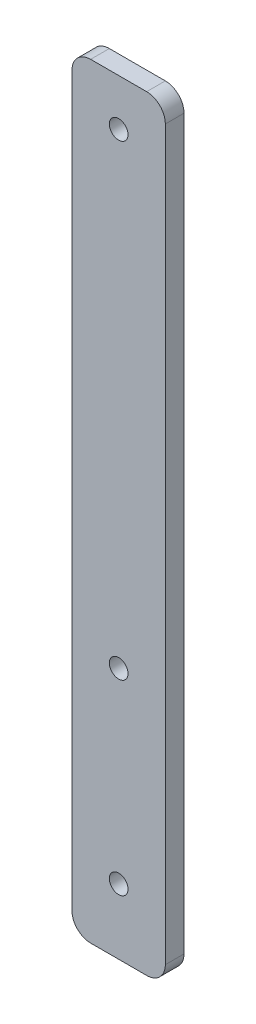
ISO-10303-21;
HEADER;
FILE_DESCRIPTION(('STEP AP214'),'2;1');
FILE_NAME('part.step','',(''),(''),'','','');
FILE_SCHEMA(('AUTOMOTIVE_DESIGN { 1 0 10303 214 1 1 1 1 }'));
ENDSEC;
DATA;
#1=APPLICATION_CONTEXT('core data for automotive mechanical design processes');
#2=APPLICATION_PROTOCOL_DEFINITION('international standard','automotive_design',2000,#1);
#3=PRODUCT_CONTEXT('',#1,'mechanical');
#4=PRODUCT('Part','Part','',(#3));
#5=PRODUCT_RELATED_PRODUCT_CATEGORY('part','',(#4));
#6=PRODUCT_DEFINITION_FORMATION('','',#4);
#7=PRODUCT_DEFINITION_CONTEXT('part definition',#1,'design');
#8=PRODUCT_DEFINITION('design','',#6,#7);
#9=PRODUCT_DEFINITION_SHAPE('','',#8);
#10=(LENGTH_UNIT() NAMED_UNIT(*) SI_UNIT(.MILLI.,.METRE.));
#11=(NAMED_UNIT(*) PLANE_ANGLE_UNIT() SI_UNIT($,.RADIAN.));
#12=(NAMED_UNIT(*) SI_UNIT($,.STERADIAN.) SOLID_ANGLE_UNIT());
#13=UNCERTAINTY_MEASURE_WITH_UNIT(LENGTH_MEASURE(1.E-05),#10,'distance_accuracy_value','');
#14=(GEOMETRIC_REPRESENTATION_CONTEXT(3) GLOBAL_UNCERTAINTY_ASSIGNED_CONTEXT((#13)) GLOBAL_UNIT_ASSIGNED_CONTEXT((#10,
#11,#12)) REPRESENTATION_CONTEXT('',''));
#15=CARTESIAN_POINT('',(0.,0.,0.));
#16=DIRECTION('',(0.,0.,1.));
#17=DIRECTION('',(1.,0.,0.));
#18=AXIS2_PLACEMENT_3D('',#15,#16,#17);
#19=CARTESIAN_POINT('',(0.,0.,10.));
#20=DIRECTION('',(0.,0.,1.));
#21=DIRECTION('',(1.,0.,0.));
#22=AXIS2_PLACEMENT_3D('',#19,#20,#21);
#23=PLANE('',#22);
#24=CARTESIAN_POINT('',(25.,-375.,10.));
#25=DIRECTION('',(0.,0.,1.));
#26=DIRECTION('',(1.,0.,0.));
#27=AXIS2_PLACEMENT_3D('',#24,#25,#26);
#28=CIRCLE('',#27,5.);
#29=CARTESIAN_POINT('',(30.,-375.,10.));
#30=VERTEX_POINT('',#29);
#31=EDGE_CURVE('E194',#30,#30,#28,.T.);
#32=ORIENTED_EDGE('',*,*,#31,.F.);
#33=EDGE_LOOP('',(#32));
#34=FACE_BOUND('',#33,.T.);
#35=CARTESIAN_POINT('',(25.,-275.,10.));
#36=DIRECTION('',(0.,0.,1.));
#37=DIRECTION('',(1.,0.,0.));
#38=AXIS2_PLACEMENT_3D('',#35,#36,#37);
#39=CIRCLE('',#38,5.);
#40=CARTESIAN_POINT('',(30.,-275.,10.));
#41=VERTEX_POINT('',#40);
#42=EDGE_CURVE('E129',#41,#41,#39,.T.);
#43=ORIENTED_EDGE('',*,*,#42,.F.);
#44=EDGE_LOOP('',(#43));
#45=FACE_BOUND('',#44,.T.);
#46=DIRECTION('',(-1.,0.,0.));
#47=VECTOR('',#46,1.);
#48=CARTESIAN_POINT('',(0.,0.,10.));
#49=LINE('',#48,#47);
#50=CARTESIAN_POINT('',(40.,0.,10.));
#51=VERTEX_POINT('',#50);
#52=CARTESIAN_POINT('',(10.,0.,10.));
#53=VERTEX_POINT('',#52);
#54=EDGE_CURVE('E138',#51,#53,#49,.T.);
#55=ORIENTED_EDGE('',*,*,#54,.T.);
#56=CARTESIAN_POINT('',(10.,-10.,10.));
#57=DIRECTION('',(0.,0.,1.));
#58=DIRECTION('',(1.,0.,0.));
#59=AXIS2_PLACEMENT_3D('',#56,#57,#58);
#60=CIRCLE('',#59,10.);
#61=CARTESIAN_POINT('',(0.,-10.,10.));
#62=VERTEX_POINT('',#61);
#63=EDGE_CURVE('E156',#53,#62,#60,.T.);
#64=ORIENTED_EDGE('',*,*,#63,.T.);
#65=DIRECTION('',(0.,-1.,0.));
#66=VECTOR('',#65,1.);
#67=CARTESIAN_POINT('',(0.,0.,10.));
#68=LINE('',#67,#66);
#69=CARTESIAN_POINT('',(0.,-400.,10.));
#70=VERTEX_POINT('',#69);
#71=EDGE_CURVE('E120',#62,#70,#68,.T.);
#72=ORIENTED_EDGE('',*,*,#71,.T.);
#73=CARTESIAN_POINT('',(10.,-400.,10.));
#74=DIRECTION('',(0.,0.,1.));
#75=DIRECTION('',(1.,0.,0.));
#76=AXIS2_PLACEMENT_3D('',#73,#74,#75);
#77=CIRCLE('',#76,10.);
#78=CARTESIAN_POINT('',(10.,-410.,10.));
#79=VERTEX_POINT('',#78);
#80=EDGE_CURVE('E152',#70,#79,#77,.T.);
#81=ORIENTED_EDGE('',*,*,#80,.T.);
#82=DIRECTION('',(1.,0.,0.));
#83=VECTOR('',#82,1.);
#84=CARTESIAN_POINT('',(0.,-410.,10.));
#85=LINE('',#84,#83);
#86=CARTESIAN_POINT('',(40.,-410.,10.));
#87=VERTEX_POINT('',#86);
#88=EDGE_CURVE('E165',#79,#87,#85,.T.);
#89=ORIENTED_EDGE('',*,*,#88,.T.);
#90=CARTESIAN_POINT('',(40.,-400.,10.));
#91=DIRECTION('',(0.,0.,1.));
#92=DIRECTION('',(1.,0.,0.));
#93=AXIS2_PLACEMENT_3D('',#90,#91,#92);
#94=CIRCLE('',#93,10.);
#95=CARTESIAN_POINT('',(50.,-400.,10.));
#96=VERTEX_POINT('',#95);
#97=EDGE_CURVE('E55',#87,#96,#94,.T.);
#98=ORIENTED_EDGE('',*,*,#97,.T.);
#99=DIRECTION('',(0.,1.,0.));
#100=VECTOR('',#99,1.);
#101=CARTESIAN_POINT('',(50.,0.,10.));
#102=LINE('',#101,#100);
#103=CARTESIAN_POINT('',(50.,-9.99999999999999,10.));
#104=VERTEX_POINT('',#103);
#105=EDGE_CURVE('E171',#96,#104,#102,.T.);
#106=ORIENTED_EDGE('',*,*,#105,.T.);
#107=CARTESIAN_POINT('',(40.,-10.,10.));
#108=DIRECTION('',(0.,0.,1.));
#109=DIRECTION('',(1.,0.,0.));
#110=AXIS2_PLACEMENT_3D('',#107,#108,#109);
#111=CIRCLE('',#110,10.);
#112=EDGE_CURVE('E154',#104,#51,#111,.T.);
#113=ORIENTED_EDGE('',*,*,#112,.T.);
#114=EDGE_LOOP('',(#55,#64,#72,#81,#89,#98,#106,#113));
#115=FACE_BOUND('',#114,.T.);
#116=CARTESIAN_POINT('',(25.,-25.,10.));
#117=DIRECTION('',(0.,0.,1.));
#118=DIRECTION('',(1.,0.,0.));
#119=AXIS2_PLACEMENT_3D('',#116,#117,#118);
#120=CIRCLE('',#119,5.);
#121=CARTESIAN_POINT('',(30.,-25.,10.));
#122=VERTEX_POINT('',#121);
#123=EDGE_CURVE('E186',#122,#122,#120,.T.);
#124=ORIENTED_EDGE('',*,*,#123,.F.);
#125=EDGE_LOOP('',(#124));
#126=FACE_BOUND('',#125,.T.);
#127=ADVANCED_FACE('F33',(#34,#45,#115,#126),#23,.T.);
#128=CARTESIAN_POINT('',(0.,0.,0.));
#129=DIRECTION('',(0.,0.,1.));
#130=DIRECTION('',(1.,0.,0.));
#131=AXIS2_PLACEMENT_3D('',#128,#129,#130);
#132=PLANE('',#131);
#133=CARTESIAN_POINT('',(25.,-375.,0.));
#134=DIRECTION('',(0.,0.,1.));
#135=DIRECTION('',(1.,0.,0.));
#136=AXIS2_PLACEMENT_3D('',#133,#134,#135);
#137=CIRCLE('',#136,5.);
#138=CARTESIAN_POINT('',(30.,-375.,0.));
#139=VERTEX_POINT('',#138);
#140=EDGE_CURVE('E191',#139,#139,#137,.T.);
#141=ORIENTED_EDGE('',*,*,#140,.T.);
#142=EDGE_LOOP('',(#141));
#143=FACE_BOUND('',#142,.T.);
#144=DIRECTION('',(0.,-1.,0.));
#145=VECTOR('',#144,1.);
#146=CARTESIAN_POINT('',(0.,0.,0.));
#147=LINE('',#146,#145);
#148=CARTESIAN_POINT('',(0.,-10.,0.));
#149=VERTEX_POINT('',#148);
#150=CARTESIAN_POINT('',(0.,-400.,0.));
#151=VERTEX_POINT('',#150);
#152=EDGE_CURVE('E117',#149,#151,#147,.T.);
#153=ORIENTED_EDGE('',*,*,#152,.F.);
#154=CARTESIAN_POINT('',(10.,-10.,0.));
#155=DIRECTION('',(0.,0.,1.));
#156=DIRECTION('',(1.,0.,0.));
#157=AXIS2_PLACEMENT_3D('',#154,#155,#156);
#158=CIRCLE('',#157,10.);
#159=CARTESIAN_POINT('',(10.,0.,0.));
#160=VERTEX_POINT('',#159);
#161=EDGE_CURVE('E100',#149,#160,#158,.F.);
#162=ORIENTED_EDGE('',*,*,#161,.T.);
#163=DIRECTION('',(-1.,0.,0.));
#164=VECTOR('',#163,1.);
#165=CARTESIAN_POINT('',(0.,0.,0.));
#166=LINE('',#165,#164);
#167=CARTESIAN_POINT('',(40.,0.,0.));
#168=VERTEX_POINT('',#167);
#169=EDGE_CURVE('E142',#168,#160,#166,.T.);
#170=ORIENTED_EDGE('',*,*,#169,.F.);
#171=CARTESIAN_POINT('',(40.,-10.,0.));
#172=DIRECTION('',(0.,0.,1.));
#173=DIRECTION('',(1.,0.,0.));
#174=AXIS2_PLACEMENT_3D('',#171,#172,#173);
#175=CIRCLE('',#174,10.);
#176=CARTESIAN_POINT('',(50.,-9.99999999999999,0.));
#177=VERTEX_POINT('',#176);
#178=EDGE_CURVE('E111',#168,#177,#175,.F.);
#179=ORIENTED_EDGE('',*,*,#178,.T.);
#180=DIRECTION('',(0.,1.,0.));
#181=VECTOR('',#180,1.);
#182=CARTESIAN_POINT('',(50.,0.,0.));
#183=LINE('',#182,#181);
#184=CARTESIAN_POINT('',(50.,-400.,0.));
#185=VERTEX_POINT('',#184);
#186=EDGE_CURVE('E132',#185,#177,#183,.T.);
#187=ORIENTED_EDGE('',*,*,#186,.F.);
#188=CARTESIAN_POINT('',(40.,-400.,0.));
#189=DIRECTION('',(0.,0.,1.));
#190=DIRECTION('',(1.,0.,0.));
#191=AXIS2_PLACEMENT_3D('',#188,#189,#190);
#192=CIRCLE('',#191,10.);
#193=CARTESIAN_POINT('',(40.,-410.,0.));
#194=VERTEX_POINT('',#193);
#195=EDGE_CURVE('E121',#185,#194,#192,.F.);
#196=ORIENTED_EDGE('',*,*,#195,.T.);
#197=DIRECTION('',(1.,0.,0.));
#198=VECTOR('',#197,1.);
#199=CARTESIAN_POINT('',(0.,-410.,0.));
#200=LINE('',#199,#198);
#201=CARTESIAN_POINT('',(10.,-410.,0.));
#202=VERTEX_POINT('',#201);
#203=EDGE_CURVE('E128',#202,#194,#200,.T.);
#204=ORIENTED_EDGE('',*,*,#203,.F.);
#205=CARTESIAN_POINT('',(10.,-400.,0.));
#206=DIRECTION('',(0.,0.,1.));
#207=DIRECTION('',(1.,0.,0.));
#208=AXIS2_PLACEMENT_3D('',#205,#206,#207);
#209=CIRCLE('',#208,10.);
#210=EDGE_CURVE('E127',#202,#151,#209,.F.);
#211=ORIENTED_EDGE('',*,*,#210,.T.);
#212=EDGE_LOOP('',(#153,#162,#170,#179,#187,#196,#204,#211));
#213=FACE_BOUND('',#212,.T.);
#214=CARTESIAN_POINT('',(25.,-275.,0.));
#215=DIRECTION('',(0.,0.,1.));
#216=DIRECTION('',(1.,0.,0.));
#217=AXIS2_PLACEMENT_3D('',#214,#215,#216);
#218=CIRCLE('',#217,5.);
#219=CARTESIAN_POINT('',(30.,-275.,0.));
#220=VERTEX_POINT('',#219);
#221=EDGE_CURVE('E135',#220,#220,#218,.T.);
#222=ORIENTED_EDGE('',*,*,#221,.T.);
#223=EDGE_LOOP('',(#222));
#224=FACE_BOUND('',#223,.T.);
#225=CARTESIAN_POINT('',(25.,-25.,0.));
#226=DIRECTION('',(0.,0.,1.));
#227=DIRECTION('',(1.,0.,0.));
#228=AXIS2_PLACEMENT_3D('',#225,#226,#227);
#229=CIRCLE('',#228,5.);
#230=CARTESIAN_POINT('',(30.,-25.,0.));
#231=VERTEX_POINT('',#230);
#232=EDGE_CURVE('E188',#231,#231,#229,.T.);
#233=ORIENTED_EDGE('',*,*,#232,.T.);
#234=EDGE_LOOP('',(#233));
#235=FACE_BOUND('',#234,.T.);
#236=ADVANCED_FACE('F124',(#143,#213,#224,#235),#132,.F.);
#237=CARTESIAN_POINT('',(0.,0.,10.));
#238=DIRECTION('',(1.,0.,0.));
#239=DIRECTION('',(0.,1.,0.));
#240=AXIS2_PLACEMENT_3D('',#237,#238,#239);
#241=PLANE('',#240);
#242=ORIENTED_EDGE('',*,*,#71,.F.);
#243=DIRECTION('',(0.,0.,-1.));
#244=VECTOR('',#243,1.);
#245=CARTESIAN_POINT('',(0.,-10.,10.));
#246=LINE('',#245,#244);
#247=EDGE_CURVE('E104',#62,#149,#246,.T.);
#248=ORIENTED_EDGE('',*,*,#247,.T.);
#249=ORIENTED_EDGE('',*,*,#152,.T.);
#250=DIRECTION('',(0.,0.,-1.));
#251=VECTOR('',#250,1.);
#252=CARTESIAN_POINT('',(0.,-400.,10.));
#253=LINE('',#252,#251);
#254=EDGE_CURVE('E122',#151,#70,#253,.F.);
#255=ORIENTED_EDGE('',*,*,#254,.T.);
#256=EDGE_LOOP('',(#242,#248,#249,#255));
#257=FACE_BOUND('',#256,.T.);
#258=ADVANCED_FACE('F116',(#257),#241,.F.);
#259=CARTESIAN_POINT('',(0.,-410.,10.));
#260=DIRECTION('',(0.,1.,0.));
#261=DIRECTION('',(0.,0.,1.));
#262=AXIS2_PLACEMENT_3D('',#259,#260,#261);
#263=PLANE('',#262);
#264=ORIENTED_EDGE('',*,*,#88,.F.);
#265=DIRECTION('',(0.,0.,-1.));
#266=VECTOR('',#265,1.);
#267=CARTESIAN_POINT('',(10.,-410.,10.));
#268=LINE('',#267,#266);
#269=EDGE_CURVE('E11',#79,#202,#268,.T.);
#270=ORIENTED_EDGE('',*,*,#269,.T.);
#271=ORIENTED_EDGE('',*,*,#203,.T.);
#272=DIRECTION('',(0.,0.,-1.));
#273=VECTOR('',#272,1.);
#274=CARTESIAN_POINT('',(40.,-410.,10.));
#275=LINE('',#274,#273);
#276=EDGE_CURVE('E41',#194,#87,#275,.F.);
#277=ORIENTED_EDGE('',*,*,#276,.T.);
#278=EDGE_LOOP('',(#264,#270,#271,#277));
#279=FACE_BOUND('',#278,.T.);
#280=ADVANCED_FACE('F164',(#279),#263,.F.);
#281=CARTESIAN_POINT('',(50.,0.,10.));
#282=DIRECTION('',(-1.,0.,0.));
#283=DIRECTION('',(0.,-1.,0.));
#284=AXIS2_PLACEMENT_3D('',#281,#282,#283);
#285=PLANE('',#284);
#286=ORIENTED_EDGE('',*,*,#186,.T.);
#287=DIRECTION('',(0.,0.,-1.));
#288=VECTOR('',#287,1.);
#289=CARTESIAN_POINT('',(50.,-10.,10.));
#290=LINE('',#289,#288);
#291=EDGE_CURVE('E48',#177,#104,#290,.F.);
#292=ORIENTED_EDGE('',*,*,#291,.T.);
#293=ORIENTED_EDGE('',*,*,#105,.F.);
#294=DIRECTION('',(0.,0.,-1.));
#295=VECTOR('',#294,1.);
#296=CARTESIAN_POINT('',(50.,-400.,10.));
#297=LINE('',#296,#295);
#298=EDGE_CURVE('E158',#96,#185,#297,.T.);
#299=ORIENTED_EDGE('',*,*,#298,.T.);
#300=EDGE_LOOP('',(#286,#292,#293,#299));
#301=FACE_BOUND('',#300,.T.);
#302=ADVANCED_FACE('F175',(#301),#285,.F.);
#303=CARTESIAN_POINT('',(0.,0.,10.));
#304=DIRECTION('',(0.,-1.,0.));
#305=DIRECTION('',(0.,0.,-1.));
#306=AXIS2_PLACEMENT_3D('',#303,#304,#305);
#307=PLANE('',#306);
#308=ORIENTED_EDGE('',*,*,#169,.T.);
#309=DIRECTION('',(0.,0.,-1.));
#310=VECTOR('',#309,1.);
#311=CARTESIAN_POINT('',(10.,0.,10.));
#312=LINE('',#311,#310);
#313=EDGE_CURVE('E105',#160,#53,#312,.F.);
#314=ORIENTED_EDGE('',*,*,#313,.T.);
#315=ORIENTED_EDGE('',*,*,#54,.F.);
#316=DIRECTION('',(0.,0.,-1.));
#317=VECTOR('',#316,1.);
#318=CARTESIAN_POINT('',(40.,0.,10.));
#319=LINE('',#318,#317);
#320=EDGE_CURVE('E110',#51,#168,#319,.T.);
#321=ORIENTED_EDGE('',*,*,#320,.T.);
#322=EDGE_LOOP('',(#308,#314,#315,#321));
#323=FACE_BOUND('',#322,.T.);
#324=ADVANCED_FACE('F182',(#323),#307,.F.);
#325=CARTESIAN_POINT('',(25.,-275.,10.));
#326=DIRECTION('',(0.,0.,-1.));
#327=DIRECTION('',(-1.,0.,0.));
#328=AXIS2_PLACEMENT_3D('',#325,#326,#327);
#329=CYLINDRICAL_SURFACE('',#328,5.);
#330=ORIENTED_EDGE('',*,*,#42,.T.);
#331=EDGE_LOOP('',(#330));
#332=FACE_BOUND('',#331,.T.);
#333=ORIENTED_EDGE('',*,*,#221,.F.);
#334=EDGE_LOOP('',(#333));
#335=FACE_BOUND('',#334,.T.);
#336=ADVANCED_FACE('F212',(#332,#335),#329,.F.);
#337=CARTESIAN_POINT('',(25.,-25.,10.));
#338=DIRECTION('',(0.,0.,-1.));
#339=DIRECTION('',(-1.,0.,0.));
#340=AXIS2_PLACEMENT_3D('',#337,#338,#339);
#341=CYLINDRICAL_SURFACE('',#340,5.);
#342=ORIENTED_EDGE('',*,*,#123,.T.);
#343=EDGE_LOOP('',(#342));
#344=FACE_BOUND('',#343,.T.);
#345=ORIENTED_EDGE('',*,*,#232,.F.);
#346=EDGE_LOOP('',(#345));
#347=FACE_BOUND('',#346,.T.);
#348=ADVANCED_FACE('F215',(#344,#347),#341,.F.);
#349=CARTESIAN_POINT('',(10.,-10.,10.));
#350=DIRECTION('',(0.,0.,-1.));
#351=DIRECTION('',(-1.,0.,0.));
#352=AXIS2_PLACEMENT_3D('',#349,#350,#351);
#353=CYLINDRICAL_SURFACE('',#352,10.);
#354=ORIENTED_EDGE('',*,*,#63,.F.);
#355=ORIENTED_EDGE('',*,*,#313,.F.);
#356=ORIENTED_EDGE('',*,*,#161,.F.);
#357=ORIENTED_EDGE('',*,*,#247,.F.);
#358=EDGE_LOOP('',(#354,#355,#356,#357));
#359=FACE_BOUND('',#358,.T.);
#360=ADVANCED_FACE('F103',(#359),#353,.T.);
#361=CARTESIAN_POINT('',(40.,-10.,10.));
#362=DIRECTION('',(0.,0.,-1.));
#363=DIRECTION('',(-1.,0.,0.));
#364=AXIS2_PLACEMENT_3D('',#361,#362,#363);
#365=CYLINDRICAL_SURFACE('',#364,10.);
#366=ORIENTED_EDGE('',*,*,#112,.F.);
#367=ORIENTED_EDGE('',*,*,#291,.F.);
#368=ORIENTED_EDGE('',*,*,#178,.F.);
#369=ORIENTED_EDGE('',*,*,#320,.F.);
#370=EDGE_LOOP('',(#366,#367,#368,#369));
#371=FACE_BOUND('',#370,.T.);
#372=ADVANCED_FACE('F179',(#371),#365,.T.);
#373=CARTESIAN_POINT('',(10.,-400.,10.));
#374=DIRECTION('',(0.,0.,-1.));
#375=DIRECTION('',(-1.,0.,0.));
#376=AXIS2_PLACEMENT_3D('',#373,#374,#375);
#377=CYLINDRICAL_SURFACE('',#376,10.);
#378=ORIENTED_EDGE('',*,*,#80,.F.);
#379=ORIENTED_EDGE('',*,*,#254,.F.);
#380=ORIENTED_EDGE('',*,*,#210,.F.);
#381=ORIENTED_EDGE('',*,*,#269,.F.);
#382=EDGE_LOOP('',(#378,#379,#380,#381));
#383=FACE_BOUND('',#382,.T.);
#384=ADVANCED_FACE('F240',(#383),#377,.T.);
#385=CARTESIAN_POINT('',(40.,-400.,10.));
#386=DIRECTION('',(0.,0.,-1.));
#387=DIRECTION('',(-1.,0.,0.));
#388=AXIS2_PLACEMENT_3D('',#385,#386,#387);
#389=CYLINDRICAL_SURFACE('',#388,10.);
#390=ORIENTED_EDGE('',*,*,#97,.F.);
#391=ORIENTED_EDGE('',*,*,#276,.F.);
#392=ORIENTED_EDGE('',*,*,#195,.F.);
#393=ORIENTED_EDGE('',*,*,#298,.F.);
#394=EDGE_LOOP('',(#390,#391,#392,#393));
#395=FACE_BOUND('',#394,.T.);
#396=ADVANCED_FACE('F35',(#395),#389,.T.);
#397=CARTESIAN_POINT('',(25.,-375.,0.));
#398=DIRECTION('',(0.,0.,1.));
#399=DIRECTION('',(1.,0.,0.));
#400=AXIS2_PLACEMENT_3D('',#397,#398,#399);
#401=CYLINDRICAL_SURFACE('',#400,5.);
#402=ORIENTED_EDGE('',*,*,#140,.F.);
#403=EDGE_LOOP('',(#402));
#404=FACE_BOUND('',#403,.T.);
#405=ORIENTED_EDGE('',*,*,#31,.T.);
#406=EDGE_LOOP('',(#405));
#407=FACE_BOUND('',#406,.T.);
#408=ADVANCED_FACE('F201',(#404,#407),#401,.F.);
#409=CLOSED_SHELL('',(#127,#236,#258,#280,#302,#324,#336,#348,#360,#372,#384,#396,#408));
#410=MANIFOLD_SOLID_BREP('B2',#409);
#411=ADVANCED_BREP_SHAPE_REPRESENTATION('',(#18,#410),#14);
#412=SHAPE_DEFINITION_REPRESENTATION(#9,#411);
ENDSEC;
END-ISO-10303-21;
